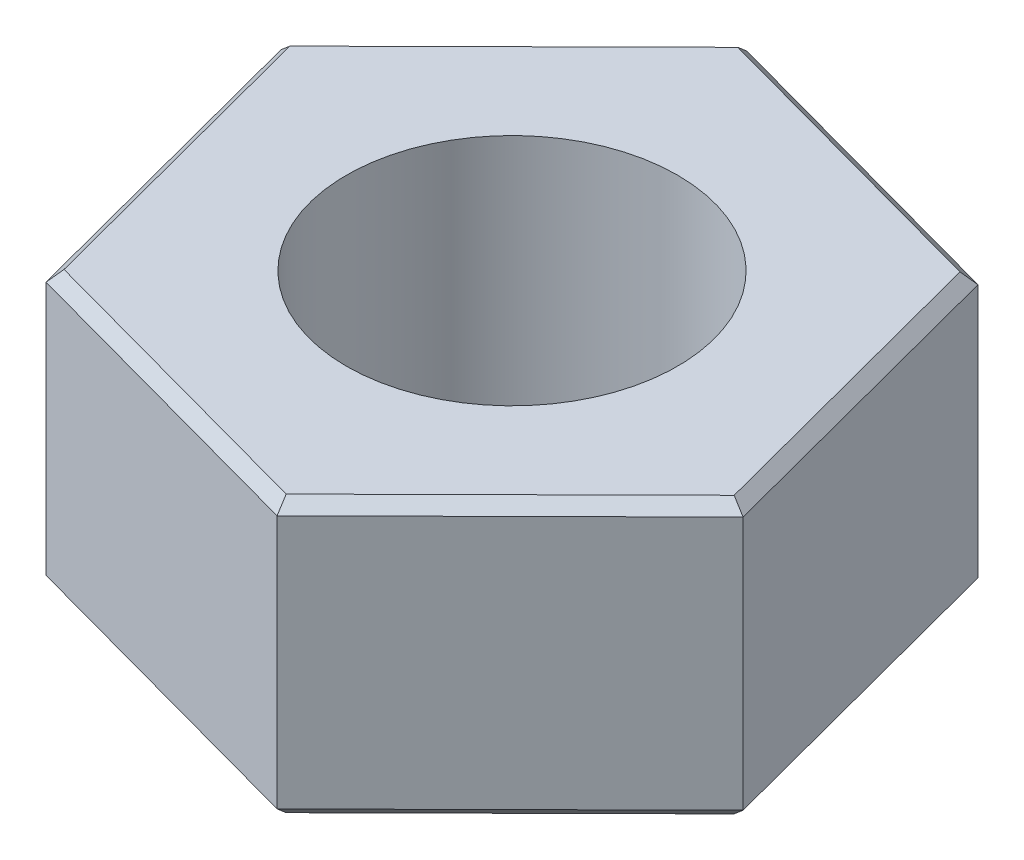
ISO-10303-21;
HEADER;
FILE_DESCRIPTION(('STEP AP214'),'2;1');
FILE_NAME('part.step','',(''),(''),'','','');
FILE_SCHEMA(('AUTOMOTIVE_DESIGN { 1 0 10303 214 1 1 1 1 }'));
ENDSEC;
DATA;
#1=APPLICATION_CONTEXT('core data for automotive mechanical design processes');
#2=APPLICATION_PROTOCOL_DEFINITION('international standard','automotive_design',2000,#1);
#3=PRODUCT_CONTEXT('',#1,'mechanical');
#4=PRODUCT('Part','Part','',(#3));
#5=PRODUCT_RELATED_PRODUCT_CATEGORY('part','',(#4));
#6=PRODUCT_DEFINITION_FORMATION('','',#4);
#7=PRODUCT_DEFINITION_CONTEXT('part definition',#1,'design');
#8=PRODUCT_DEFINITION('design','',#6,#7);
#9=PRODUCT_DEFINITION_SHAPE('','',#8);
#10=(LENGTH_UNIT() NAMED_UNIT(*) SI_UNIT(.MILLI.,.METRE.));
#11=(NAMED_UNIT(*) PLANE_ANGLE_UNIT() SI_UNIT($,.RADIAN.));
#12=(NAMED_UNIT(*) SI_UNIT($,.STERADIAN.) SOLID_ANGLE_UNIT());
#13=UNCERTAINTY_MEASURE_WITH_UNIT(LENGTH_MEASURE(1.E-05),#10,'distance_accuracy_value','');
#14=(GEOMETRIC_REPRESENTATION_CONTEXT(3) GLOBAL_UNCERTAINTY_ASSIGNED_CONTEXT((#13)) GLOBAL_UNIT_ASSIGNED_CONTEXT((#10,
#11,#12)) REPRESENTATION_CONTEXT('',''));
#15=CARTESIAN_POINT('',(0.,0.,0.));
#16=DIRECTION('',(0.,0.,1.));
#17=DIRECTION('',(1.,0.,0.));
#18=AXIS2_PLACEMENT_3D('',#15,#16,#17);
#19=CARTESIAN_POINT('',(0.,5.,0.));
#20=DIRECTION('',(0.,1.,0.));
#21=DIRECTION('',(0.,0.,1.));
#22=AXIS2_PLACEMENT_3D('',#19,#20,#21);
#23=PLANE('',#22);
#24=DIRECTION('',(-0.254245472714405,0.,-0.9671397208285));
#25=VECTOR('',#24,1.);
#26=CARTESIAN_POINT('',(4.04856422213206,5.,-4.15118624021761));
#27=LINE('',#26,#25);
#28=CARTESIAN_POINT('',(5.53727974806323,5.,1.51182873019822));
#29=VERTEX_POINT('',#28);
#30=CARTESIAN_POINT('',(4.07792196055444,5.,-4.03951056458475));
#31=VERTEX_POINT('',#30);
#32=EDGE_CURVE('E43',#29,#31,#27,.T.);
#33=ORIENTED_EDGE('',*,*,#32,.T.);
#34=DIRECTION('',(-0.964690303603673,0.,-0.263386822246392));
#35=VECTOR('',#34,1.);
#36=CARTESIAN_POINT('',(-1.57075062880283,5.,-5.58175258532796));
#37=LINE('',#36,#35);
#38=CARTESIAN_POINT('',(-1.45935778750879,5.,-5.55133929478297));
#39=VERTEX_POINT('',#38);
#40=EDGE_CURVE('E11',#31,#39,#37,.T.);
#41=ORIENTED_EDGE('',*,*,#40,.T.);
#42=DIRECTION('',(-0.710444830889268,0.,0.703752898582108));
#43=VECTOR('',#42,1.);
#44=CARTESIAN_POINT('',(-5.61931485093489,5.,-1.43056634511034));
#45=LINE('',#44,#43);
#46=CARTESIAN_POINT('',(-5.53727974806323,5.,-1.51182873019822));
#47=VERTEX_POINT('',#46);
#48=EDGE_CURVE('E199',#39,#47,#45,.T.);
#49=ORIENTED_EDGE('',*,*,#48,.T.);
#50=DIRECTION('',(0.254245472714405,0.,0.9671397208285));
#51=VECTOR('',#50,1.);
#52=CARTESIAN_POINT('',(-4.04856422213206,5.,4.15118624021761));
#53=LINE('',#52,#51);
#54=CARTESIAN_POINT('',(-4.07792196055445,5.,4.03951056458475));
#55=VERTEX_POINT('',#54);
#56=EDGE_CURVE('E153',#47,#55,#53,.T.);
#57=ORIENTED_EDGE('',*,*,#56,.T.);
#58=DIRECTION('',(0.964690303603673,0.,0.263386822246392));
#59=VECTOR('',#58,1.);
#60=CARTESIAN_POINT('',(1.57075062880283,5.,5.58175258532796));
#61=LINE('',#60,#59);
#62=CARTESIAN_POINT('',(1.45935778750879,5.,5.55133929478297));
#63=VERTEX_POINT('',#62);
#64=EDGE_CURVE('E201',#55,#63,#61,.T.);
#65=ORIENTED_EDGE('',*,*,#64,.T.);
#66=DIRECTION('',(0.710444830889268,0.,-0.703752898582108));
#67=VECTOR('',#66,1.);
#68=CARTESIAN_POINT('',(5.61931485093489,5.,1.43056634511034));
#69=LINE('',#68,#67);
#70=EDGE_CURVE('E54',#63,#29,#69,.T.);
#71=ORIENTED_EDGE('',*,*,#70,.T.);
#72=EDGE_LOOP('',(#33,#41,#49,#57,#65,#71));
#73=FACE_BOUND('',#72,.T.);
#74=CARTESIAN_POINT('',(0.,5.,0.));
#75=DIRECTION('',(0.,1.,0.));
#76=DIRECTION('',(0.,0.,1.));
#77=AXIS2_PLACEMENT_3D('',#74,#75,#76);
#78=CIRCLE('',#77,3.);
#79=CARTESIAN_POINT('',(0.,5.,3.));
#80=VERTEX_POINT('',#79);
#81=EDGE_CURVE('E147',#80,#80,#78,.T.);
#82=ORIENTED_EDGE('',*,*,#81,.F.);
#83=EDGE_LOOP('',(#82));
#84=FACE_BOUND('',#83,.T.);
#85=ADVANCED_FACE('F34',(#73,#84),#23,.T.);
#86=CARTESIAN_POINT('',(0.,0.,0.));
#87=DIRECTION('',(0.,1.,0.));
#88=DIRECTION('',(0.,0.,1.));
#89=AXIS2_PLACEMENT_3D('',#86,#87,#88);
#90=PLANE('',#89);
#91=DIRECTION('',(-0.254245472714405,0.,-0.9671397208285));
#92=VECTOR('',#91,1.);
#93=CARTESIAN_POINT('',(-4.80760085430884,0.,1.26384091719326));
#94=LINE('',#93,#92);
#95=CARTESIAN_POINT('',(-4.07792196055445,0.,4.03951056458475));
#96=VERTEX_POINT('',#95);
#97=CARTESIAN_POINT('',(-5.53727974806324,0.,-1.51182873019822));
#98=VERTEX_POINT('',#97);
#99=EDGE_CURVE('E163',#96,#98,#94,.T.);
#100=ORIENTED_EDGE('',*,*,#99,.T.);
#101=DIRECTION('',(0.710444830889268,0.,-0.703752898582108));
#102=VECTOR('',#101,1.);
#103=CARTESIAN_POINT('',(-3.49831876778601,0.,-3.53158401249059));
#104=LINE('',#103,#102);
#105=CARTESIAN_POINT('',(-1.45935778750879,0.,-5.55133929478297));
#106=VERTEX_POINT('',#105);
#107=EDGE_CURVE('E178',#98,#106,#104,.T.);
#108=ORIENTED_EDGE('',*,*,#107,.T.);
#109=DIRECTION('',(0.964690303603673,0.,0.263386822246392));
#110=VECTOR('',#109,1.);
#111=CARTESIAN_POINT('',(1.30928208652283,0.,-4.79542492968386));
#112=LINE('',#111,#110);
#113=CARTESIAN_POINT('',(4.07792196055444,0.,-4.03951056458475));
#114=VERTEX_POINT('',#113);
#115=EDGE_CURVE('E176',#106,#114,#112,.T.);
#116=ORIENTED_EDGE('',*,*,#115,.T.);
#117=DIRECTION('',(0.254245472714405,0.,0.9671397208285));
#118=VECTOR('',#117,1.);
#119=CARTESIAN_POINT('',(4.80760085430884,0.,-1.26384091719327));
#120=LINE('',#119,#118);
#121=CARTESIAN_POINT('',(5.53727974806323,0.,1.51182873019822));
#122=VERTEX_POINT('',#121);
#123=EDGE_CURVE('E174',#114,#122,#120,.T.);
#124=ORIENTED_EDGE('',*,*,#123,.T.);
#125=DIRECTION('',(-0.710444830889268,0.,0.703752898582108));
#126=VECTOR('',#125,1.);
#127=CARTESIAN_POINT('',(3.49831876778601,0.,3.53158401249059));
#128=LINE('',#127,#126);
#129=CARTESIAN_POINT('',(1.45935778750879,0.,5.55133929478297));
#130=VERTEX_POINT('',#129);
#131=EDGE_CURVE('E172',#122,#130,#128,.T.);
#132=ORIENTED_EDGE('',*,*,#131,.T.);
#133=DIRECTION('',(-0.964690303603673,0.,-0.263386822246392));
#134=VECTOR('',#133,1.);
#135=CARTESIAN_POINT('',(-1.30928208652283,0.,4.79542492968386));
#136=LINE('',#135,#134);
#137=EDGE_CURVE('E170',#130,#96,#136,.T.);
#138=ORIENTED_EDGE('',*,*,#137,.T.);
#139=EDGE_LOOP('',(#100,#108,#116,#124,#132,#138));
#140=FACE_BOUND('',#139,.T.);
#141=CARTESIAN_POINT('',(0.,0.,0.));
#142=DIRECTION('',(0.,1.,0.));
#143=DIRECTION('',(0.,0.,1.));
#144=AXIS2_PLACEMENT_3D('',#141,#142,#143);
#145=CIRCLE('',#144,3.);
#146=CARTESIAN_POINT('',(0.,0.,3.));
#147=VERTEX_POINT('',#146);
#148=EDGE_CURVE('E221',#147,#147,#145,.T.);
#149=ORIENTED_EDGE('',*,*,#148,.T.);
#150=EDGE_LOOP('',(#149));
#151=FACE_BOUND('',#150,.T.);
#152=ADVANCED_FACE('F258',(#140,#151),#90,.F.);
#153=CARTESIAN_POINT('',(-5.76006543065132,5.,-1.5726553112882));
#154=DIRECTION('',(0.9671397208285,0.,-0.254245472714405));
#155=DIRECTION('',(-0.254245472714405,0.,-0.9671397208285));
#156=AXIS2_PLACEMENT_3D('',#153,#154,#155);
#157=PLANE('',#156);
#158=DIRECTION('',(0.,-1.,0.));
#159=VECTOR('',#158,1.);
#160=CARTESIAN_POINT('',(-5.76006543065132,5.,-1.5726553112882));
#161=LINE('',#160,#159);
#162=CARTESIAN_POINT('',(-5.76006543065132,4.8,-1.5726553112882));
#163=VERTEX_POINT('',#162);
#164=CARTESIAN_POINT('',(-5.76006543065132,0.200000000000001,-1.5726553112882));
#165=VERTEX_POINT('',#164);
#166=EDGE_CURVE('E127',#163,#165,#161,.T.);
#167=ORIENTED_EDGE('',*,*,#166,.T.);
#168=DIRECTION('',(0.254245472714405,0.,0.9671397208285));
#169=VECTOR('',#168,1.);
#170=CARTESIAN_POINT('',(-5.76006543065132,0.200000000000001,-1.5726553112882));
#171=LINE('',#170,#169);
#172=CARTESIAN_POINT('',(-4.24199216629777,0.200000000000001,4.20203533476049));
#173=VERTEX_POINT('',#172);
#174=EDGE_CURVE('E134',#165,#173,#171,.T.);
#175=ORIENTED_EDGE('',*,*,#174,.T.);
#176=DIRECTION('',(0.,-1.,0.));
#177=VECTOR('',#176,1.);
#178=CARTESIAN_POINT('',(-4.24199216629777,5.,4.20203533476049));
#179=LINE('',#178,#177);
#180=CARTESIAN_POINT('',(-4.24199216629777,4.8,4.20203533476049));
#181=VERTEX_POINT('',#180);
#182=EDGE_CURVE('E129',#181,#173,#179,.T.);
#183=ORIENTED_EDGE('',*,*,#182,.F.);
#184=DIRECTION('',(-0.254245472714405,0.,-0.9671397208285));
#185=VECTOR('',#184,1.);
#186=CARTESIAN_POINT('',(-5.76006543065132,4.8,-1.5726553112882));
#187=LINE('',#186,#185);
#188=EDGE_CURVE('E124',#181,#163,#187,.T.);
#189=ORIENTED_EDGE('',*,*,#188,.T.);
#190=EDGE_LOOP('',(#167,#175,#183,#189));
#191=FACE_BOUND('',#190,.T.);
#192=ADVANCED_FACE('F126',(#191),#157,.F.);
#193=CARTESIAN_POINT('',(-4.24199216629777,5.,4.20203533476049));
#194=DIRECTION('',(0.263386822246392,0.,-0.964690303603673));
#195=DIRECTION('',(-0.964690303603673,0.,-0.263386822246392));
#196=AXIS2_PLACEMENT_3D('',#193,#194,#195);
#197=PLANE('',#196);
#198=ORIENTED_EDGE('',*,*,#182,.T.);
#199=DIRECTION('',(0.964690303603673,0.,0.263386822246392));
#200=VECTOR('',#199,1.);
#201=CARTESIAN_POINT('',(-4.24199216629777,0.200000000000001,4.20203533476049));
#202=LINE('',#201,#200);
#203=CARTESIAN_POINT('',(1.51807326435355,0.200000000000001,5.77469064604869));
#204=VERTEX_POINT('',#203);
#205=EDGE_CURVE('E135',#173,#204,#202,.T.);
#206=ORIENTED_EDGE('',*,*,#205,.T.);
#207=DIRECTION('',(0.,-1.,0.));
#208=VECTOR('',#207,1.);
#209=CARTESIAN_POINT('',(1.51807326435355,5.,5.77469064604869));
#210=LINE('',#209,#208);
#211=CARTESIAN_POINT('',(1.51807326435355,4.8,5.77469064604869));
#212=VERTEX_POINT('',#211);
#213=EDGE_CURVE('E165',#212,#204,#210,.T.);
#214=ORIENTED_EDGE('',*,*,#213,.F.);
#215=DIRECTION('',(-0.964690303603673,0.,-0.263386822246392));
#216=VECTOR('',#215,1.);
#217=CARTESIAN_POINT('',(-4.24199216629777,4.8,4.20203533476049));
#218=LINE('',#217,#216);
#219=EDGE_CURVE('E194',#212,#181,#218,.T.);
#220=ORIENTED_EDGE('',*,*,#219,.T.);
#221=EDGE_LOOP('',(#198,#206,#214,#220));
#222=FACE_BOUND('',#221,.T.);
#223=ADVANCED_FACE('F236',(#222),#197,.F.);
#224=CARTESIAN_POINT('',(1.51807326435355,5.,5.77469064604869));
#225=DIRECTION('',(-0.703752898582108,0.,-0.710444830889268));
#226=DIRECTION('',(-0.710444830889268,0.,0.703752898582108));
#227=AXIS2_PLACEMENT_3D('',#224,#225,#226);
#228=PLANE('',#227);
#229=ORIENTED_EDGE('',*,*,#213,.T.);
#230=DIRECTION('',(0.710444830889268,0.,-0.703752898582108));
#231=VECTOR('',#230,1.);
#232=CARTESIAN_POINT('',(1.51807326435355,0.200000000000001,5.77469064604869));
#233=LINE('',#232,#231);
#234=CARTESIAN_POINT('',(5.76006543065132,0.200000000000001,1.5726553112882));
#235=VERTEX_POINT('',#234);
#236=EDGE_CURVE('E192',#204,#235,#233,.T.);
#237=ORIENTED_EDGE('',*,*,#236,.T.);
#238=DIRECTION('',(0.,-1.,0.));
#239=VECTOR('',#238,1.);
#240=CARTESIAN_POINT('',(5.76006543065132,5.,1.5726553112882));
#241=LINE('',#240,#239);
#242=CARTESIAN_POINT('',(5.76006543065132,4.8,1.5726553112882));
#243=VERTEX_POINT('',#242);
#244=EDGE_CURVE('E241',#243,#235,#241,.T.);
#245=ORIENTED_EDGE('',*,*,#244,.F.);
#246=DIRECTION('',(-0.710444830889268,0.,0.703752898582108));
#247=VECTOR('',#246,1.);
#248=CARTESIAN_POINT('',(1.51807326435355,4.8,5.77469064604869));
#249=LINE('',#248,#247);
#250=EDGE_CURVE('E190',#243,#212,#249,.T.);
#251=ORIENTED_EDGE('',*,*,#250,.T.);
#252=EDGE_LOOP('',(#229,#237,#245,#251));
#253=FACE_BOUND('',#252,.T.);
#254=ADVANCED_FACE('F276',(#253),#228,.F.);
#255=CARTESIAN_POINT('',(5.76006543065132,5.,1.5726553112882));
#256=DIRECTION('',(-0.9671397208285,0.,0.254245472714405));
#257=DIRECTION('',(0.254245472714405,0.,0.9671397208285));
#258=AXIS2_PLACEMENT_3D('',#255,#256,#257);
#259=PLANE('',#258);
#260=ORIENTED_EDGE('',*,*,#244,.T.);
#261=DIRECTION('',(-0.254245472714405,0.,-0.9671397208285));
#262=VECTOR('',#261,1.);
#263=CARTESIAN_POINT('',(5.76006543065132,0.200000000000001,1.5726553112882));
#264=LINE('',#263,#262);
#265=CARTESIAN_POINT('',(4.24199216629776,0.200000000000001,-4.20203533476049));
#266=VERTEX_POINT('',#265);
#267=EDGE_CURVE('E188',#235,#266,#264,.T.);
#268=ORIENTED_EDGE('',*,*,#267,.T.);
#269=DIRECTION('',(0.,-1.,0.));
#270=VECTOR('',#269,1.);
#271=CARTESIAN_POINT('',(4.24199216629776,5.,-4.20203533476049));
#272=LINE('',#271,#270);
#273=CARTESIAN_POINT('',(4.24199216629776,4.8,-4.20203533476049));
#274=VERTEX_POINT('',#273);
#275=EDGE_CURVE('E243',#274,#266,#272,.T.);
#276=ORIENTED_EDGE('',*,*,#275,.F.);
#277=DIRECTION('',(0.254245472714405,0.,0.9671397208285));
#278=VECTOR('',#277,1.);
#279=CARTESIAN_POINT('',(5.76006543065132,4.8,1.5726553112882));
#280=LINE('',#279,#278);
#281=EDGE_CURVE('E186',#274,#243,#280,.T.);
#282=ORIENTED_EDGE('',*,*,#281,.T.);
#283=EDGE_LOOP('',(#260,#268,#276,#282));
#284=FACE_BOUND('',#283,.T.);
#285=ADVANCED_FACE('F272',(#284),#259,.F.);
#286=CARTESIAN_POINT('',(4.24199216629776,5.,-4.20203533476049));
#287=DIRECTION('',(-0.263386822246392,0.,0.964690303603673));
#288=DIRECTION('',(0.964690303603673,0.,0.263386822246392));
#289=AXIS2_PLACEMENT_3D('',#286,#287,#288);
#290=PLANE('',#289);
#291=ORIENTED_EDGE('',*,*,#275,.T.);
#292=DIRECTION('',(-0.964690303603673,0.,-0.263386822246392));
#293=VECTOR('',#292,1.);
#294=CARTESIAN_POINT('',(4.24199216629776,0.200000000000001,-4.20203533476049));
#295=LINE('',#294,#293);
#296=CARTESIAN_POINT('',(-1.51807326435355,0.200000000000001,-5.77469064604869));
#297=VERTEX_POINT('',#296);
#298=EDGE_CURVE('E184',#266,#297,#295,.T.);
#299=ORIENTED_EDGE('',*,*,#298,.T.);
#300=DIRECTION('',(0.,-1.,0.));
#301=VECTOR('',#300,1.);
#302=CARTESIAN_POINT('',(-1.51807326435355,5.,-5.77469064604869));
#303=LINE('',#302,#301);
#304=CARTESIAN_POINT('',(-1.51807326435355,4.8,-5.77469064604869));
#305=VERTEX_POINT('',#304);
#306=EDGE_CURVE('E146',#305,#297,#303,.T.);
#307=ORIENTED_EDGE('',*,*,#306,.F.);
#308=DIRECTION('',(0.964690303603673,0.,0.263386822246392));
#309=VECTOR('',#308,1.);
#310=CARTESIAN_POINT('',(4.24199216629776,4.8,-4.20203533476049));
#311=LINE('',#310,#309);
#312=EDGE_CURVE('E181',#305,#274,#311,.T.);
#313=ORIENTED_EDGE('',*,*,#312,.T.);
#314=EDGE_LOOP('',(#291,#299,#307,#313));
#315=FACE_BOUND('',#314,.T.);
#316=ADVANCED_FACE('F269',(#315),#290,.F.);
#317=CARTESIAN_POINT('',(-1.51807326435355,5.,-5.77469064604869));
#318=DIRECTION('',(0.703752898582108,0.,0.710444830889268));
#319=DIRECTION('',(0.710444830889268,0.,-0.703752898582108));
#320=AXIS2_PLACEMENT_3D('',#317,#318,#319);
#321=PLANE('',#320);
#322=ORIENTED_EDGE('',*,*,#306,.T.);
#323=DIRECTION('',(-0.710444830889268,0.,0.703752898582108));
#324=VECTOR('',#323,1.);
#325=CARTESIAN_POINT('',(-1.51807326435355,0.200000000000001,-5.77469064604869));
#326=LINE('',#325,#324);
#327=EDGE_CURVE('E145',#297,#165,#326,.T.);
#328=ORIENTED_EDGE('',*,*,#327,.T.);
#329=ORIENTED_EDGE('',*,*,#166,.F.);
#330=DIRECTION('',(0.710444830889268,0.,-0.703752898582108));
#331=VECTOR('',#330,1.);
#332=CARTESIAN_POINT('',(-1.51807326435355,4.8,-5.77469064604869));
#333=LINE('',#332,#331);
#334=EDGE_CURVE('E142',#163,#305,#333,.T.);
#335=ORIENTED_EDGE('',*,*,#334,.T.);
#336=EDGE_LOOP('',(#322,#328,#329,#335));
#337=FACE_BOUND('',#336,.T.);
#338=ADVANCED_FACE('F140',(#337),#321,.F.);
#339=CARTESIAN_POINT('',(0.,5.,0.));
#340=DIRECTION('',(0.,-1.,0.));
#341=DIRECTION('',(0.,0.,-1.));
#342=AXIS2_PLACEMENT_3D('',#339,#340,#341);
#343=CYLINDRICAL_SURFACE('',#342,3.);
#344=ORIENTED_EDGE('',*,*,#81,.T.);
#345=EDGE_LOOP('',(#344));
#346=FACE_BOUND('',#345,.T.);
#347=ORIENTED_EDGE('',*,*,#148,.F.);
#348=EDGE_LOOP('',(#347));
#349=FACE_BOUND('',#348,.T.);
#350=ADVANCED_FACE('F254',(#346,#349),#343,.F.);
#351=CARTESIAN_POINT('',(1.51807326435355,0.200000000000001,5.77469064604869));
#352=DIRECTION('',(-0.497628446867099,0.707106781186546,-0.502360357580733));
#353=DIRECTION('',(0.710444830889268,0.,-0.703752898582108));
#354=AXIS2_PLACEMENT_3D('',#351,#352,#353);
#355=PLANE('',#354);
#356=DIRECTION('',(0.19219151221896,0.654653670707978,0.73108890981847));
#357=VECTOR('',#356,1.);
#358=CARTESIAN_POINT('',(1.08433804596683,-1.27741359414819,4.12477903289194));
#359=LINE('',#358,#357);
#360=EDGE_CURVE('E215',#130,#204,#359,.T.);
#361=ORIENTED_EDGE('',*,*,#360,.F.);
#362=ORIENTED_EDGE('',*,*,#131,.F.);
#363=DIRECTION('',(0.729237324437348,0.654653670707978,0.199101722935861));
#364=VECTOR('',#363,1.);
#365=CARTESIAN_POINT('',(4.11433245046521,-1.27741359414822,1.12332522234872));
#366=LINE('',#365,#364);
#367=EDGE_CURVE('E218',#235,#122,#366,.F.);
#368=ORIENTED_EDGE('',*,*,#367,.F.);
#369=ORIENTED_EDGE('',*,*,#236,.F.);
#370=EDGE_LOOP('',(#361,#362,#368,#369));
#371=FACE_BOUND('',#370,.T.);
#372=ADVANCED_FACE('F303',(#371),#355,.F.);
#373=CARTESIAN_POINT('',(5.76006543065132,0.200000000000001,1.5726553112882));
#374=DIRECTION('',(-0.683871054952697,0.707106781186547,0.179778697842335));
#375=DIRECTION('',(-0.254245472714405,0.,-0.9671397208285));
#376=AXIS2_PLACEMENT_3D('',#373,#374,#375);
#377=PLANE('',#376);
#378=ORIENTED_EDGE('',*,*,#367,.T.);
#379=ORIENTED_EDGE('',*,*,#123,.F.);
#380=DIRECTION('',(0.537045812218384,0.654653670707977,-0.531987186882605));
#381=VECTOR('',#380,1.);
#382=CARTESIAN_POINT('',(3.0299944044984,-1.2774135941482,-3.00145381054321));
#383=LINE('',#382,#381);
#384=EDGE_CURVE('E212',#266,#114,#383,.F.);
#385=ORIENTED_EDGE('',*,*,#384,.F.);
#386=ORIENTED_EDGE('',*,*,#267,.F.);
#387=EDGE_LOOP('',(#378,#379,#385,#386));
#388=FACE_BOUND('',#387,.T.);
#389=ADVANCED_FACE('F299',(#388),#377,.F.);
#390=CARTESIAN_POINT('',(-4.24199216629777,0.200000000000001,4.20203533476049));
#391=DIRECTION('',(0.186242608085599,0.707106781186547,-0.682139055423067));
#392=DIRECTION('',(0.964690303603673,0.,0.263386822246392));
#393=AXIS2_PLACEMENT_3D('',#390,#391,#392);
#394=PLANE('',#393);
#395=ORIENTED_EDGE('',*,*,#360,.T.);
#396=ORIENTED_EDGE('',*,*,#205,.F.);
#397=DIRECTION('',(-0.537045812218381,0.654653670707978,0.531987186882607));
#398=VECTOR('',#397,1.);
#399=CARTESIAN_POINT('',(-3.0299944044984,-1.27741359414822,3.0014538105432));
#400=LINE('',#399,#398);
#401=EDGE_CURVE('E209',#96,#173,#400,.T.);
#402=ORIENTED_EDGE('',*,*,#401,.F.);
#403=ORIENTED_EDGE('',*,*,#137,.F.);
#404=EDGE_LOOP('',(#395,#396,#402,#403));
#405=FACE_BOUND('',#404,.T.);
#406=ADVANCED_FACE('F295',(#405),#394,.F.);
#407=CARTESIAN_POINT('',(4.24199216629776,0.200000000000001,-4.20203533476049));
#408=DIRECTION('',(-0.1862426080856,0.707106781186547,0.682139055423067));
#409=DIRECTION('',(-0.964690303603673,0.,-0.263386822246392));
#410=AXIS2_PLACEMENT_3D('',#407,#408,#409);
#411=PLANE('',#410);
#412=ORIENTED_EDGE('',*,*,#384,.T.);
#413=ORIENTED_EDGE('',*,*,#115,.F.);
#414=DIRECTION('',(-0.19219151221896,0.654653670707978,-0.73108890981847));
#415=VECTOR('',#414,1.);
#416=CARTESIAN_POINT('',(-1.08433804596683,-1.27741359414819,-4.12477903289194));
#417=LINE('',#416,#415);
#418=EDGE_CURVE('E207',#297,#106,#417,.F.);
#419=ORIENTED_EDGE('',*,*,#418,.F.);
#420=ORIENTED_EDGE('',*,*,#298,.F.);
#421=EDGE_LOOP('',(#412,#413,#419,#420));
#422=FACE_BOUND('',#421,.T.);
#423=ADVANCED_FACE('F291',(#422),#411,.F.);
#424=CARTESIAN_POINT('',(-5.76006543065132,0.200000000000001,-1.5726553112882));
#425=DIRECTION('',(0.683871054952698,0.707106781186546,-0.179778697842336));
#426=DIRECTION('',(0.254245472714405,0.,0.9671397208285));
#427=AXIS2_PLACEMENT_3D('',#424,#425,#426);
#428=PLANE('',#427);
#429=ORIENTED_EDGE('',*,*,#401,.T.);
#430=ORIENTED_EDGE('',*,*,#174,.F.);
#431=DIRECTION('',(0.729237324437346,-0.654653670707979,0.199101722935864));
#432=VECTOR('',#431,1.);
#433=CARTESIAN_POINT('',(-5.76006543065132,0.200000000000001,-1.5726553112882));
#434=LINE('',#433,#432);
#435=EDGE_CURVE('E205',#98,#165,#434,.F.);
#436=ORIENTED_EDGE('',*,*,#435,.F.);
#437=ORIENTED_EDGE('',*,*,#99,.F.);
#438=EDGE_LOOP('',(#429,#430,#436,#437));
#439=FACE_BOUND('',#438,.T.);
#440=ADVANCED_FACE('F287',(#439),#428,.F.);
#441=CARTESIAN_POINT('',(-1.51807326435355,0.200000000000001,-5.77469064604869));
#442=DIRECTION('',(0.497628446867099,0.707106781186546,0.502360357580733));
#443=DIRECTION('',(-0.710444830889268,0.,0.703752898582108));
#444=AXIS2_PLACEMENT_3D('',#441,#442,#443);
#445=PLANE('',#444);
#446=ORIENTED_EDGE('',*,*,#418,.T.);
#447=ORIENTED_EDGE('',*,*,#107,.F.);
#448=ORIENTED_EDGE('',*,*,#435,.T.);
#449=ORIENTED_EDGE('',*,*,#327,.F.);
#450=EDGE_LOOP('',(#446,#447,#448,#449));
#451=FACE_BOUND('',#450,.T.);
#452=ADVANCED_FACE('F284',(#451),#445,.F.);
#453=CARTESIAN_POINT('',(-1.30928208652283,5.,4.79542492968386));
#454=DIRECTION('',(-0.1862426080856,0.707106781186544,0.68213905542307));
#455=DIRECTION('',(-0.964690303603673,0.,-0.263386822246392));
#456=AXIS2_PLACEMENT_3D('',#453,#454,#455);
#457=PLANE('',#456);
#458=DIRECTION('',(0.537045812218379,0.654653670707981,-0.531987186882605));
#459=VECTOR('',#458,1.);
#460=CARTESIAN_POINT('',(-3.49536168047524,5.71013536850268,3.46243762678693));
#461=LINE('',#460,#459);
#462=EDGE_CURVE('E225',#181,#55,#461,.T.);
#463=ORIENTED_EDGE('',*,*,#462,.F.);
#464=ORIENTED_EDGE('',*,*,#219,.F.);
#465=DIRECTION('',(-0.192191512218964,0.65465367070798,-0.731088909818467));
#466=VECTOR('',#465,1.);
#467=CARTESIAN_POINT('',(1.25087810357896,5.71013536850268,4.75829082409969));
#468=LINE('',#467,#466);
#469=EDGE_CURVE('E38',#63,#212,#468,.F.);
#470=ORIENTED_EDGE('',*,*,#469,.F.);
#471=ORIENTED_EDGE('',*,*,#64,.F.);
#472=EDGE_LOOP('',(#463,#464,#470,#471));
#473=FACE_BOUND('',#472,.T.);
#474=ADVANCED_FACE('F36',(#473),#457,.T.);
#475=CARTESIAN_POINT('',(3.49831876778601,5.,3.53158401249059));
#476=DIRECTION('',(0.497628446867099,0.707106781186545,0.502360357580733));
#477=DIRECTION('',(-0.710444830889268,0.,0.703752898582108));
#478=AXIS2_PLACEMENT_3D('',#475,#476,#477);
#479=PLANE('',#478);
#480=ORIENTED_EDGE('',*,*,#469,.T.);
#481=ORIENTED_EDGE('',*,*,#250,.F.);
#482=DIRECTION('',(-0.729237324437345,0.65465367070798,-0.199101722935865));
#483=VECTOR('',#482,1.);
#484=CARTESIAN_POINT('',(4.74623978405421,5.71013536850267,1.29585319731276));
#485=LINE('',#484,#483);
#486=EDGE_CURVE('E156',#29,#243,#485,.F.);
#487=ORIENTED_EDGE('',*,*,#486,.F.);
#488=ORIENTED_EDGE('',*,*,#70,.F.);
#489=EDGE_LOOP('',(#480,#481,#487,#488));
#490=FACE_BOUND('',#489,.T.);
#491=ADVANCED_FACE('F230',(#490),#479,.T.);
#492=CARTESIAN_POINT('',(-4.80760085430884,5.,1.26384091719326));
#493=DIRECTION('',(-0.683871054952701,0.707106781186543,0.179778697842336));
#494=DIRECTION('',(-0.254245472714405,0.,-0.9671397208285));
#495=AXIS2_PLACEMENT_3D('',#492,#493,#494);
#496=PLANE('',#495);
#497=ORIENTED_EDGE('',*,*,#462,.T.);
#498=ORIENTED_EDGE('',*,*,#56,.F.);
#499=DIRECTION('',(-0.729237324437344,-0.654653670707982,-0.199101722935865));
#500=VECTOR('',#499,1.);
#501=CARTESIAN_POINT('',(-4.74623978405421,5.71013536850268,-1.29585319731276));
#502=LINE('',#501,#500);
#503=EDGE_CURVE('E151',#163,#47,#502,.F.);
#504=ORIENTED_EDGE('',*,*,#503,.F.);
#505=ORIENTED_EDGE('',*,*,#188,.F.);
#506=EDGE_LOOP('',(#497,#498,#504,#505));
#507=FACE_BOUND('',#506,.T.);
#508=ADVANCED_FACE('F152',(#507),#496,.T.);
#509=CARTESIAN_POINT('',(4.80760085430884,5.,-1.26384091719326));
#510=DIRECTION('',(0.6838710549527,0.707106781186545,-0.179778697842336));
#511=DIRECTION('',(0.254245472714405,0.,0.9671397208285));
#512=AXIS2_PLACEMENT_3D('',#509,#510,#511);
#513=PLANE('',#512);
#514=ORIENTED_EDGE('',*,*,#486,.T.);
#515=ORIENTED_EDGE('',*,*,#281,.F.);
#516=DIRECTION('',(-0.537045812218382,0.65465367070798,0.531987186882603));
#517=VECTOR('',#516,1.);
#518=CARTESIAN_POINT('',(3.49536168047524,5.71013536850267,-3.46243762678693));
#519=LINE('',#518,#517);
#520=EDGE_CURVE('E157',#31,#274,#519,.F.);
#521=ORIENTED_EDGE('',*,*,#520,.F.);
#522=ORIENTED_EDGE('',*,*,#32,.F.);
#523=EDGE_LOOP('',(#514,#515,#521,#522));
#524=FACE_BOUND('',#523,.T.);
#525=ADVANCED_FACE('F314',(#524),#513,.T.);
#526=CARTESIAN_POINT('',(-3.49831876778601,5.,-3.53158401249059));
#527=DIRECTION('',(-0.4976284468671,0.707106781186544,-0.502360357580734));
#528=DIRECTION('',(0.710444830889268,0.,-0.703752898582108));
#529=AXIS2_PLACEMENT_3D('',#526,#527,#528);
#530=PLANE('',#529);
#531=ORIENTED_EDGE('',*,*,#503,.T.);
#532=ORIENTED_EDGE('',*,*,#48,.F.);
#533=DIRECTION('',(-0.192191512218962,-0.654653670707981,-0.731088909818468));
#534=VECTOR('',#533,1.);
#535=CARTESIAN_POINT('',(-1.25087810357896,5.71013536850268,-4.75829082409969));
#536=LINE('',#535,#534);
#537=EDGE_CURVE('E161',#305,#39,#536,.F.);
#538=ORIENTED_EDGE('',*,*,#537,.F.);
#539=ORIENTED_EDGE('',*,*,#334,.F.);
#540=EDGE_LOOP('',(#531,#532,#538,#539));
#541=FACE_BOUND('',#540,.T.);
#542=ADVANCED_FACE('F160',(#541),#530,.T.);
#543=CARTESIAN_POINT('',(1.30928208652283,5.,-4.79542492968386));
#544=DIRECTION('',(0.1862426080856,0.707106781186545,-0.68213905542307));
#545=DIRECTION('',(0.964690303603673,0.,0.263386822246392));
#546=AXIS2_PLACEMENT_3D('',#543,#544,#545);
#547=PLANE('',#546);
#548=ORIENTED_EDGE('',*,*,#520,.T.);
#549=ORIENTED_EDGE('',*,*,#312,.F.);
#550=ORIENTED_EDGE('',*,*,#537,.T.);
#551=ORIENTED_EDGE('',*,*,#40,.F.);
#552=EDGE_LOOP('',(#548,#549,#550,#551));
#553=FACE_BOUND('',#552,.T.);
#554=ADVANCED_FACE('F308',(#553),#547,.T.);
#555=CLOSED_SHELL('',(#85,#152,#192,#223,#254,#285,#316,#338,#350,#372,#389,#406,#423,#440,#452,
#474,#491,#508,#525,#542,#554));
#556=MANIFOLD_SOLID_BREP('B2',#555);
#557=ADVANCED_BREP_SHAPE_REPRESENTATION('',(#18,#556),#14);
#558=SHAPE_DEFINITION_REPRESENTATION(#9,#557);
ENDSEC;
END-ISO-10303-21;
